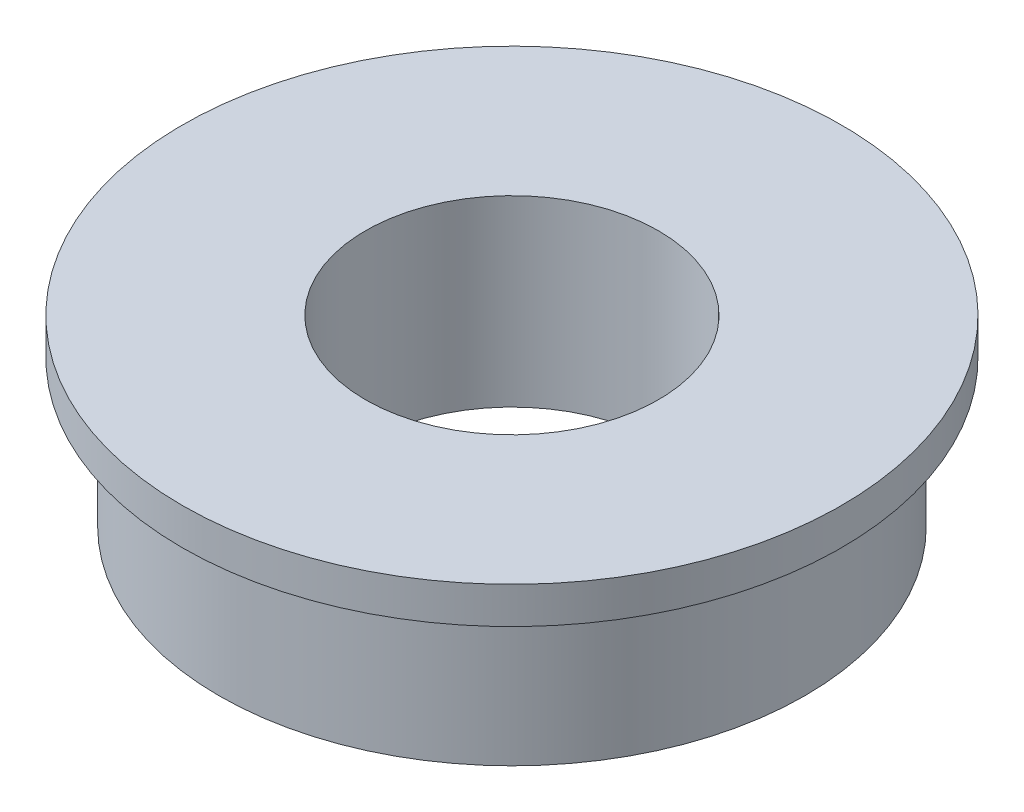
ISO-10303-21;
HEADER;
FILE_DESCRIPTION(('STEP AP214'),'2;1');
FILE_NAME('part.step','',(''),(''),'','','');
FILE_SCHEMA(('AUTOMOTIVE_DESIGN { 1 0 10303 214 1 1 1 1 }'));
ENDSEC;
DATA;
#1=APPLICATION_CONTEXT('core data for automotive mechanical design processes');
#2=APPLICATION_PROTOCOL_DEFINITION('international standard','automotive_design',2000,#1);
#3=PRODUCT_CONTEXT('',#1,'mechanical');
#4=PRODUCT('Part','Part','',(#3));
#5=PRODUCT_RELATED_PRODUCT_CATEGORY('part','',(#4));
#6=PRODUCT_DEFINITION_FORMATION('','',#4);
#7=PRODUCT_DEFINITION_CONTEXT('part definition',#1,'design');
#8=PRODUCT_DEFINITION('design','',#6,#7);
#9=PRODUCT_DEFINITION_SHAPE('','',#8);
#10=(LENGTH_UNIT() NAMED_UNIT(*) SI_UNIT(.MILLI.,.METRE.));
#11=(NAMED_UNIT(*) PLANE_ANGLE_UNIT() SI_UNIT($,.RADIAN.));
#12=(NAMED_UNIT(*) SI_UNIT($,.STERADIAN.) SOLID_ANGLE_UNIT());
#13=UNCERTAINTY_MEASURE_WITH_UNIT(LENGTH_MEASURE(1.E-05),#10,'distance_accuracy_value','');
#14=(GEOMETRIC_REPRESENTATION_CONTEXT(3) GLOBAL_UNCERTAINTY_ASSIGNED_CONTEXT((#13)) GLOBAL_UNIT_ASSIGNED_CONTEXT((#10,
#11,#12)) REPRESENTATION_CONTEXT('',''));
#15=CARTESIAN_POINT('',(0.,0.,0.));
#16=DIRECTION('',(0.,0.,1.));
#17=DIRECTION('',(1.,0.,0.));
#18=AXIS2_PLACEMENT_3D('',#15,#16,#17);
#19=CARTESIAN_POINT('',(0.,0.,0.));
#20=DIRECTION('',(0.,1.,0.));
#21=DIRECTION('',(0.,0.,1.));
#22=AXIS2_PLACEMENT_3D('',#19,#20,#21);
#23=PLANE('',#22);
#24=CARTESIAN_POINT('',(0.,0.,0.));
#25=DIRECTION('',(0.,1.,0.));
#26=DIRECTION('',(0.,0.,1.));
#27=AXIS2_PLACEMENT_3D('',#24,#25,#26);
#28=CIRCLE('',#27,8.);
#29=CARTESIAN_POINT('',(0.,0.,8.));
#30=VERTEX_POINT('',#29);
#31=EDGE_CURVE('E37',#30,#30,#28,.T.);
#32=ORIENTED_EDGE('',*,*,#31,.F.);
#33=EDGE_LOOP('',(#32));
#34=FACE_BOUND('',#33,.T.);
#35=CARTESIAN_POINT('',(0.,0.,0.));
#36=DIRECTION('',(0.,1.,0.));
#37=DIRECTION('',(0.,0.,1.));
#38=AXIS2_PLACEMENT_3D('',#35,#36,#37);
#39=CIRCLE('',#38,4.);
#40=CARTESIAN_POINT('',(0.,0.,4.));
#41=VERTEX_POINT('',#40);
#42=EDGE_CURVE('E44',#41,#41,#39,.T.);
#43=ORIENTED_EDGE('',*,*,#42,.T.);
#44=EDGE_LOOP('',(#43));
#45=FACE_BOUND('',#44,.T.);
#46=ADVANCED_FACE('F33',(#34,#45),#23,.F.);
#47=CARTESIAN_POINT('',(0.,4.,0.));
#48=DIRECTION('',(0.,-1.,0.));
#49=DIRECTION('',(0.,0.,-1.));
#50=AXIS2_PLACEMENT_3D('',#47,#48,#49);
#51=CYLINDRICAL_SURFACE('',#50,8.);
#52=CARTESIAN_POINT('',(0.,4.,0.));
#53=DIRECTION('',(0.,1.,0.));
#54=DIRECTION('',(0.,0.,1.));
#55=AXIS2_PLACEMENT_3D('',#52,#53,#54);
#56=CIRCLE('',#55,8.);
#57=CARTESIAN_POINT('',(0.,4.,8.));
#58=VERTEX_POINT('',#57);
#59=EDGE_CURVE('E10',#58,#58,#56,.T.);
#60=ORIENTED_EDGE('',*,*,#59,.F.);
#61=EDGE_LOOP('',(#60));
#62=FACE_BOUND('',#61,.T.);
#63=ORIENTED_EDGE('',*,*,#31,.T.);
#64=EDGE_LOOP('',(#63));
#65=FACE_BOUND('',#64,.T.);
#66=ADVANCED_FACE('F35',(#62,#65),#51,.T.);
#67=CARTESIAN_POINT('',(0.,4.,0.));
#68=DIRECTION('',(0.,-1.,0.));
#69=DIRECTION('',(0.,0.,-1.));
#70=AXIS2_PLACEMENT_3D('',#67,#68,#69);
#71=CYLINDRICAL_SURFACE('',#70,4.);
#72=ORIENTED_EDGE('',*,*,#42,.F.);
#73=EDGE_LOOP('',(#72));
#74=FACE_BOUND('',#73,.T.);
#75=CARTESIAN_POINT('',(0.,5.,0.));
#76=DIRECTION('',(0.,1.,0.));
#77=DIRECTION('',(0.,0.,1.));
#78=AXIS2_PLACEMENT_3D('',#75,#76,#77);
#79=CIRCLE('',#78,4.);
#80=CARTESIAN_POINT('',(0.,5.,4.));
#81=VERTEX_POINT('',#80);
#82=EDGE_CURVE('E52',#81,#81,#79,.T.);
#83=ORIENTED_EDGE('',*,*,#82,.T.);
#84=EDGE_LOOP('',(#83));
#85=FACE_BOUND('',#84,.T.);
#86=ADVANCED_FACE('F58',(#74,#85),#71,.F.);
#87=CARTESIAN_POINT('',(0.,5.,0.));
#88=DIRECTION('',(0.,1.,0.));
#89=DIRECTION('',(0.,0.,1.));
#90=AXIS2_PLACEMENT_3D('',#87,#88,#89);
#91=PLANE('',#90);
#92=CARTESIAN_POINT('',(0.,5.,0.));
#93=DIRECTION('',(0.,1.,0.));
#94=DIRECTION('',(0.,0.,1.));
#95=AXIS2_PLACEMENT_3D('',#92,#93,#94);
#96=CIRCLE('',#95,9.);
#97=CARTESIAN_POINT('',(0.,5.,9.));
#98=VERTEX_POINT('',#97);
#99=EDGE_CURVE('E48',#98,#98,#96,.T.);
#100=ORIENTED_EDGE('',*,*,#99,.T.);
#101=EDGE_LOOP('',(#100));
#102=FACE_BOUND('',#101,.T.);
#103=ORIENTED_EDGE('',*,*,#82,.F.);
#104=EDGE_LOOP('',(#103));
#105=FACE_BOUND('',#104,.T.);
#106=ADVANCED_FACE('F60',(#102,#105),#91,.T.);
#107=CARTESIAN_POINT('',(0.,4.,0.));
#108=DIRECTION('',(0.,1.,0.));
#109=DIRECTION('',(0.,0.,1.));
#110=AXIS2_PLACEMENT_3D('',#107,#108,#109);
#111=PLANE('',#110);
#112=ORIENTED_EDGE('',*,*,#59,.T.);
#113=EDGE_LOOP('',(#112));
#114=FACE_BOUND('',#113,.T.);
#115=CARTESIAN_POINT('',(0.,4.,0.));
#116=DIRECTION('',(0.,1.,0.));
#117=DIRECTION('',(0.,0.,1.));
#118=AXIS2_PLACEMENT_3D('',#115,#116,#117);
#119=CIRCLE('',#118,9.);
#120=CARTESIAN_POINT('',(0.,4.,9.));
#121=VERTEX_POINT('',#120);
#122=EDGE_CURVE('E49',#121,#121,#119,.T.);
#123=ORIENTED_EDGE('',*,*,#122,.F.);
#124=EDGE_LOOP('',(#123));
#125=FACE_BOUND('',#124,.T.);
#126=ADVANCED_FACE('F62',(#114,#125),#111,.F.);
#127=CARTESIAN_POINT('',(0.,5.,0.));
#128=DIRECTION('',(0.,-1.,0.));
#129=DIRECTION('',(0.,0.,-1.));
#130=AXIS2_PLACEMENT_3D('',#127,#128,#129);
#131=CYLINDRICAL_SURFACE('',#130,9.);
#132=ORIENTED_EDGE('',*,*,#99,.F.);
#133=EDGE_LOOP('',(#132));
#134=FACE_BOUND('',#133,.T.);
#135=ORIENTED_EDGE('',*,*,#122,.T.);
#136=EDGE_LOOP('',(#135));
#137=FACE_BOUND('',#136,.T.);
#138=ADVANCED_FACE('F69',(#134,#137),#131,.T.);
#139=CLOSED_SHELL('',(#46,#66,#86,#106,#126,#138));
#140=MANIFOLD_SOLID_BREP('B2',#139);
#141=ADVANCED_BREP_SHAPE_REPRESENTATION('',(#18,#140),#14);
#142=SHAPE_DEFINITION_REPRESENTATION(#9,#141);
ENDSEC;
END-ISO-10303-21;
